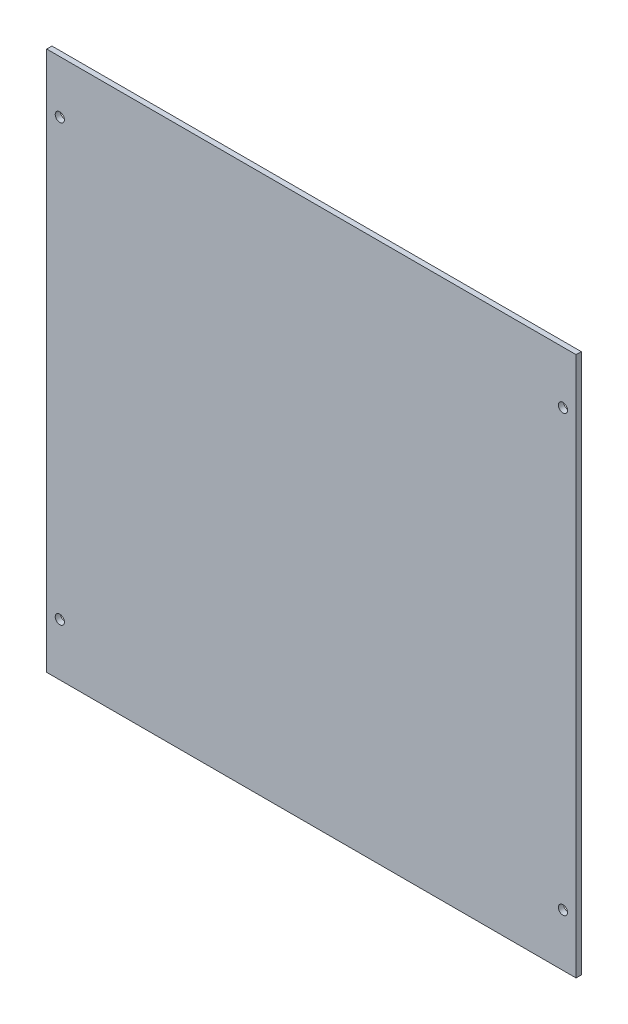
ISO-10303-21;
HEADER;
FILE_DESCRIPTION(('STEP AP214'),'2;1');
FILE_NAME('part.step','',(''),(''),'','','');
FILE_SCHEMA(('AUTOMOTIVE_DESIGN { 1 0 10303 214 1 1 1 1 }'));
ENDSEC;
DATA;
#1=APPLICATION_CONTEXT('core data for automotive mechanical design processes');
#2=APPLICATION_PROTOCOL_DEFINITION('international standard','automotive_design',2000,#1);
#3=PRODUCT_CONTEXT('',#1,'mechanical');
#4=PRODUCT('Part','Part','',(#3));
#5=PRODUCT_RELATED_PRODUCT_CATEGORY('part','',(#4));
#6=PRODUCT_DEFINITION_FORMATION('','',#4);
#7=PRODUCT_DEFINITION_CONTEXT('part definition',#1,'design');
#8=PRODUCT_DEFINITION('design','',#6,#7);
#9=PRODUCT_DEFINITION_SHAPE('','',#8);
#10=(LENGTH_UNIT() NAMED_UNIT(*) SI_UNIT(.MILLI.,.METRE.));
#11=(NAMED_UNIT(*) PLANE_ANGLE_UNIT() SI_UNIT($,.RADIAN.));
#12=(NAMED_UNIT(*) SI_UNIT($,.STERADIAN.) SOLID_ANGLE_UNIT());
#13=UNCERTAINTY_MEASURE_WITH_UNIT(LENGTH_MEASURE(1.E-05),#10,'distance_accuracy_value','');
#14=(GEOMETRIC_REPRESENTATION_CONTEXT(3) GLOBAL_UNCERTAINTY_ASSIGNED_CONTEXT((#13)) GLOBAL_UNIT_ASSIGNED_CONTEXT((#10,
#11,#12)) REPRESENTATION_CONTEXT('',''));
#15=CARTESIAN_POINT('',(0.,0.,0.));
#16=DIRECTION('',(0.,0.,1.));
#17=DIRECTION('',(1.,0.,0.));
#18=AXIS2_PLACEMENT_3D('',#15,#16,#17);
#19=CARTESIAN_POINT('',(0.,0.,2.));
#20=DIRECTION('',(0.,0.,-1.));
#21=DIRECTION('',(-1.,0.,0.));
#22=AXIS2_PLACEMENT_3D('',#19,#20,#21);
#23=PLANE('',#22);
#24=DIRECTION('',(0.,-1.,0.));
#25=VECTOR('',#24,1.);
#26=CARTESIAN_POINT('',(0.,0.,2.));
#27=LINE('',#26,#25);
#28=CARTESIAN_POINT('',(0.,206.,2.));
#29=VERTEX_POINT('',#28);
#30=CARTESIAN_POINT('',(0.,0.,2.));
#31=VERTEX_POINT('',#30);
#32=EDGE_CURVE('E95',#29,#31,#27,.T.);
#33=ORIENTED_EDGE('',*,*,#32,.T.);
#34=DIRECTION('',(1.,0.,0.));
#35=VECTOR('',#34,1.);
#36=CARTESIAN_POINT('',(0.,0.,2.));
#37=LINE('',#36,#35);
#38=CARTESIAN_POINT('',(202.,0.,2.));
#39=VERTEX_POINT('',#38);
#40=EDGE_CURVE('E90',#31,#39,#37,.T.);
#41=ORIENTED_EDGE('',*,*,#40,.T.);
#42=DIRECTION('',(0.,1.,0.));
#43=VECTOR('',#42,1.);
#44=CARTESIAN_POINT('',(202.,0.,2.));
#45=LINE('',#44,#43);
#46=CARTESIAN_POINT('',(202.,206.,2.));
#47=VERTEX_POINT('',#46);
#48=EDGE_CURVE('E93',#39,#47,#45,.T.);
#49=ORIENTED_EDGE('',*,*,#48,.T.);
#50=DIRECTION('',(-1.,0.,0.));
#51=VECTOR('',#50,1.);
#52=CARTESIAN_POINT('',(0.,206.,2.));
#53=LINE('',#52,#51);
#54=EDGE_CURVE('E60',#47,#29,#53,.T.);
#55=ORIENTED_EDGE('',*,*,#54,.T.);
#56=EDGE_LOOP('',(#33,#41,#49,#55));
#57=FACE_BOUND('',#56,.T.);
#58=CARTESIAN_POINT('',(5.,186.,2.));
#59=DIRECTION('',(0.,0.,1.));
#60=DIRECTION('',(1.,0.,0.));
#61=AXIS2_PLACEMENT_3D('',#58,#59,#60);
#62=CIRCLE('',#61,1.75);
#63=CARTESIAN_POINT('',(6.75,186.,2.));
#64=VERTEX_POINT('',#63);
#65=EDGE_CURVE('E110',#64,#64,#62,.T.);
#66=ORIENTED_EDGE('',*,*,#65,.F.);
#67=EDGE_LOOP('',(#66));
#68=FACE_BOUND('',#67,.T.);
#69=CARTESIAN_POINT('',(197.,186.,2.));
#70=DIRECTION('',(0.,0.,1.));
#71=DIRECTION('',(1.,0.,0.));
#72=AXIS2_PLACEMENT_3D('',#69,#70,#71);
#73=CIRCLE('',#72,1.75000000000001);
#74=CARTESIAN_POINT('',(198.75,186.,2.));
#75=VERTEX_POINT('',#74);
#76=EDGE_CURVE('E125',#75,#75,#73,.T.);
#77=ORIENTED_EDGE('',*,*,#76,.F.);
#78=EDGE_LOOP('',(#77));
#79=FACE_BOUND('',#78,.T.);
#80=CARTESIAN_POINT('',(5.,20.,2.));
#81=DIRECTION('',(0.,0.,1.));
#82=DIRECTION('',(1.,0.,0.));
#83=AXIS2_PLACEMENT_3D('',#80,#81,#82);
#84=CIRCLE('',#83,1.75);
#85=CARTESIAN_POINT('',(6.75,20.,2.));
#86=VERTEX_POINT('',#85);
#87=EDGE_CURVE('E131',#86,#86,#84,.T.);
#88=ORIENTED_EDGE('',*,*,#87,.F.);
#89=EDGE_LOOP('',(#88));
#90=FACE_BOUND('',#89,.T.);
#91=CARTESIAN_POINT('',(197.,20.,2.));
#92=DIRECTION('',(0.,0.,1.));
#93=DIRECTION('',(1.,0.,0.));
#94=AXIS2_PLACEMENT_3D('',#91,#92,#93);
#95=CIRCLE('',#94,1.75000000000001);
#96=CARTESIAN_POINT('',(198.75,20.,2.));
#97=VERTEX_POINT('',#96);
#98=EDGE_CURVE('E137',#97,#97,#95,.T.);
#99=ORIENTED_EDGE('',*,*,#98,.F.);
#100=EDGE_LOOP('',(#99));
#101=FACE_BOUND('',#100,.T.);
#102=ADVANCED_FACE('F43',(#57,#68,#79,#90,#101),#23,.F.);
#103=CARTESIAN_POINT('',(0.,0.,0.));
#104=DIRECTION('',(0.,0.,-1.));
#105=DIRECTION('',(-1.,0.,0.));
#106=AXIS2_PLACEMENT_3D('',#103,#104,#105);
#107=PLANE('',#106);
#108=CARTESIAN_POINT('',(5.,20.,0.));
#109=DIRECTION('',(0.,0.,1.));
#110=DIRECTION('',(1.,0.,0.));
#111=AXIS2_PLACEMENT_3D('',#108,#109,#110);
#112=CIRCLE('',#111,1.75);
#113=CARTESIAN_POINT('',(6.75,20.,0.));
#114=VERTEX_POINT('',#113);
#115=EDGE_CURVE('E134',#114,#114,#112,.T.);
#116=ORIENTED_EDGE('',*,*,#115,.T.);
#117=EDGE_LOOP('',(#116));
#118=FACE_BOUND('',#117,.T.);
#119=CARTESIAN_POINT('',(5.,186.,0.));
#120=DIRECTION('',(0.,0.,1.));
#121=DIRECTION('',(1.,0.,0.));
#122=AXIS2_PLACEMENT_3D('',#119,#120,#121);
#123=CIRCLE('',#122,1.75);
#124=CARTESIAN_POINT('',(6.75,186.,0.));
#125=VERTEX_POINT('',#124);
#126=EDGE_CURVE('E122',#125,#125,#123,.T.);
#127=ORIENTED_EDGE('',*,*,#126,.T.);
#128=EDGE_LOOP('',(#127));
#129=FACE_BOUND('',#128,.T.);
#130=DIRECTION('',(0.,-1.,0.));
#131=VECTOR('',#130,1.);
#132=CARTESIAN_POINT('',(0.,0.,0.));
#133=LINE('',#132,#131);
#134=CARTESIAN_POINT('',(0.,206.,0.));
#135=VERTEX_POINT('',#134);
#136=CARTESIAN_POINT('',(0.,0.,0.));
#137=VERTEX_POINT('',#136);
#138=EDGE_CURVE('E107',#135,#137,#133,.T.);
#139=ORIENTED_EDGE('',*,*,#138,.F.);
#140=DIRECTION('',(-1.,0.,0.));
#141=VECTOR('',#140,1.);
#142=CARTESIAN_POINT('',(0.,206.,0.));
#143=LINE('',#142,#141);
#144=CARTESIAN_POINT('',(202.,206.,0.));
#145=VERTEX_POINT('',#144);
#146=EDGE_CURVE('E83',#145,#135,#143,.T.);
#147=ORIENTED_EDGE('',*,*,#146,.F.);
#148=DIRECTION('',(0.,1.,0.));
#149=VECTOR('',#148,1.);
#150=CARTESIAN_POINT('',(202.,0.,0.));
#151=LINE('',#150,#149);
#152=CARTESIAN_POINT('',(202.,0.,0.));
#153=VERTEX_POINT('',#152);
#154=EDGE_CURVE('E77',#153,#145,#151,.T.);
#155=ORIENTED_EDGE('',*,*,#154,.F.);
#156=DIRECTION('',(1.,0.,0.));
#157=VECTOR('',#156,1.);
#158=CARTESIAN_POINT('',(0.,0.,0.));
#159=LINE('',#158,#157);
#160=EDGE_CURVE('E99',#137,#153,#159,.T.);
#161=ORIENTED_EDGE('',*,*,#160,.F.);
#162=EDGE_LOOP('',(#139,#147,#155,#161));
#163=FACE_BOUND('',#162,.T.);
#164=CARTESIAN_POINT('',(197.,186.,0.));
#165=DIRECTION('',(0.,0.,1.));
#166=DIRECTION('',(1.,0.,0.));
#167=AXIS2_PLACEMENT_3D('',#164,#165,#166);
#168=CIRCLE('',#167,1.75000000000001);
#169=CARTESIAN_POINT('',(198.75,186.,0.));
#170=VERTEX_POINT('',#169);
#171=EDGE_CURVE('E128',#170,#170,#168,.T.);
#172=ORIENTED_EDGE('',*,*,#171,.T.);
#173=EDGE_LOOP('',(#172));
#174=FACE_BOUND('',#173,.T.);
#175=CARTESIAN_POINT('',(197.,20.,0.));
#176=DIRECTION('',(0.,0.,1.));
#177=DIRECTION('',(1.,0.,0.));
#178=AXIS2_PLACEMENT_3D('',#175,#176,#177);
#179=CIRCLE('',#178,1.75000000000001);
#180=CARTESIAN_POINT('',(198.75,20.,0.));
#181=VERTEX_POINT('',#180);
#182=EDGE_CURVE('E140',#181,#181,#179,.T.);
#183=ORIENTED_EDGE('',*,*,#182,.T.);
#184=EDGE_LOOP('',(#183));
#185=FACE_BOUND('',#184,.T.);
#186=ADVANCED_FACE('F118',(#118,#129,#163,#174,#185),#107,.T.);
#187=CARTESIAN_POINT('',(0.,0.,2.));
#188=DIRECTION('',(1.,0.,0.));
#189=DIRECTION('',(0.,0.,-1.));
#190=AXIS2_PLACEMENT_3D('',#187,#188,#189);
#191=PLANE('',#190);
#192=ORIENTED_EDGE('',*,*,#138,.T.);
#193=DIRECTION('',(0.,0.,-1.));
#194=VECTOR('',#193,1.);
#195=CARTESIAN_POINT('',(0.,0.,2.));
#196=LINE('',#195,#194);
#197=EDGE_CURVE('E11',#31,#137,#196,.T.);
#198=ORIENTED_EDGE('',*,*,#197,.F.);
#199=ORIENTED_EDGE('',*,*,#32,.F.);
#200=DIRECTION('',(0.,0.,-1.));
#201=VECTOR('',#200,1.);
#202=CARTESIAN_POINT('',(0.,206.,2.));
#203=LINE('',#202,#201);
#204=EDGE_CURVE('E103',#29,#135,#203,.T.);
#205=ORIENTED_EDGE('',*,*,#204,.T.);
#206=EDGE_LOOP('',(#192,#198,#199,#205));
#207=FACE_BOUND('',#206,.T.);
#208=ADVANCED_FACE('F45',(#207),#191,.F.);
#209=CARTESIAN_POINT('',(0.,0.,2.));
#210=DIRECTION('',(0.,1.,0.));
#211=DIRECTION('',(0.,0.,1.));
#212=AXIS2_PLACEMENT_3D('',#209,#210,#211);
#213=PLANE('',#212);
#214=ORIENTED_EDGE('',*,*,#160,.T.);
#215=DIRECTION('',(0.,0.,-1.));
#216=VECTOR('',#215,1.);
#217=CARTESIAN_POINT('',(202.,0.,2.));
#218=LINE('',#217,#216);
#219=EDGE_CURVE('E52',#39,#153,#218,.T.);
#220=ORIENTED_EDGE('',*,*,#219,.F.);
#221=ORIENTED_EDGE('',*,*,#40,.F.);
#222=ORIENTED_EDGE('',*,*,#197,.T.);
#223=EDGE_LOOP('',(#214,#220,#221,#222));
#224=FACE_BOUND('',#223,.T.);
#225=ADVANCED_FACE('F98',(#224),#213,.F.);
#226=CARTESIAN_POINT('',(202.,0.,2.));
#227=DIRECTION('',(-1.,0.,0.));
#228=DIRECTION('',(0.,0.,1.));
#229=AXIS2_PLACEMENT_3D('',#226,#227,#228);
#230=PLANE('',#229);
#231=ORIENTED_EDGE('',*,*,#154,.T.);
#232=DIRECTION('',(0.,0.,-1.));
#233=VECTOR('',#232,1.);
#234=CARTESIAN_POINT('',(202.,206.,2.));
#235=LINE('',#234,#233);
#236=EDGE_CURVE('E100',#47,#145,#235,.T.);
#237=ORIENTED_EDGE('',*,*,#236,.F.);
#238=ORIENTED_EDGE('',*,*,#48,.F.);
#239=ORIENTED_EDGE('',*,*,#219,.T.);
#240=EDGE_LOOP('',(#231,#237,#238,#239));
#241=FACE_BOUND('',#240,.T.);
#242=ADVANCED_FACE('F101',(#241),#230,.F.);
#243=CARTESIAN_POINT('',(0.,206.,2.));
#244=DIRECTION('',(0.,-1.,0.));
#245=DIRECTION('',(0.,0.,-1.));
#246=AXIS2_PLACEMENT_3D('',#243,#244,#245);
#247=PLANE('',#246);
#248=ORIENTED_EDGE('',*,*,#146,.T.);
#249=ORIENTED_EDGE('',*,*,#204,.F.);
#250=ORIENTED_EDGE('',*,*,#54,.F.);
#251=ORIENTED_EDGE('',*,*,#236,.T.);
#252=EDGE_LOOP('',(#248,#249,#250,#251));
#253=FACE_BOUND('',#252,.T.);
#254=ADVANCED_FACE('F115',(#253),#247,.F.);
#255=CARTESIAN_POINT('',(5.,186.,2.));
#256=DIRECTION('',(0.,0.,-1.));
#257=DIRECTION('',(-1.,0.,0.));
#258=AXIS2_PLACEMENT_3D('',#255,#256,#257);
#259=CYLINDRICAL_SURFACE('',#258,1.75);
#260=ORIENTED_EDGE('',*,*,#65,.T.);
#261=EDGE_LOOP('',(#260));
#262=FACE_BOUND('',#261,.T.);
#263=ORIENTED_EDGE('',*,*,#126,.F.);
#264=EDGE_LOOP('',(#263));
#265=FACE_BOUND('',#264,.T.);
#266=ADVANCED_FACE('F157',(#262,#265),#259,.F.);
#267=CARTESIAN_POINT('',(197.,186.,2.));
#268=DIRECTION('',(0.,0.,-1.));
#269=DIRECTION('',(-1.,0.,0.));
#270=AXIS2_PLACEMENT_3D('',#267,#268,#269);
#271=CYLINDRICAL_SURFACE('',#270,1.75000000000001);
#272=ORIENTED_EDGE('',*,*,#76,.T.);
#273=EDGE_LOOP('',(#272));
#274=FACE_BOUND('',#273,.T.);
#275=ORIENTED_EDGE('',*,*,#171,.F.);
#276=EDGE_LOOP('',(#275));
#277=FACE_BOUND('',#276,.T.);
#278=ADVANCED_FACE('F202',(#274,#277),#271,.F.);
#279=CARTESIAN_POINT('',(5.,20.,2.));
#280=DIRECTION('',(0.,0.,-1.));
#281=DIRECTION('',(-1.,0.,0.));
#282=AXIS2_PLACEMENT_3D('',#279,#280,#281);
#283=CYLINDRICAL_SURFACE('',#282,1.75);
#284=ORIENTED_EDGE('',*,*,#87,.T.);
#285=EDGE_LOOP('',(#284));
#286=FACE_BOUND('',#285,.T.);
#287=ORIENTED_EDGE('',*,*,#115,.F.);
#288=EDGE_LOOP('',(#287));
#289=FACE_BOUND('',#288,.T.);
#290=ADVANCED_FACE('F210',(#286,#289),#283,.F.);
#291=CARTESIAN_POINT('',(197.,20.,2.));
#292=DIRECTION('',(0.,0.,-1.));
#293=DIRECTION('',(-1.,0.,0.));
#294=AXIS2_PLACEMENT_3D('',#291,#292,#293);
#295=CYLINDRICAL_SURFACE('',#294,1.75000000000001);
#296=ORIENTED_EDGE('',*,*,#98,.T.);
#297=EDGE_LOOP('',(#296));
#298=FACE_BOUND('',#297,.T.);
#299=ORIENTED_EDGE('',*,*,#182,.F.);
#300=EDGE_LOOP('',(#299));
#301=FACE_BOUND('',#300,.T.);
#302=ADVANCED_FACE('F146',(#298,#301),#295,.F.);
#303=CLOSED_SHELL('',(#102,#186,#208,#225,#242,#254,#266,#278,#290,#302));
#304=MANIFOLD_SOLID_BREP('B2',#303);
#305=ADVANCED_BREP_SHAPE_REPRESENTATION('',(#18,#304),#14);
#306=SHAPE_DEFINITION_REPRESENTATION(#9,#305);
ENDSEC;
END-ISO-10303-21;
